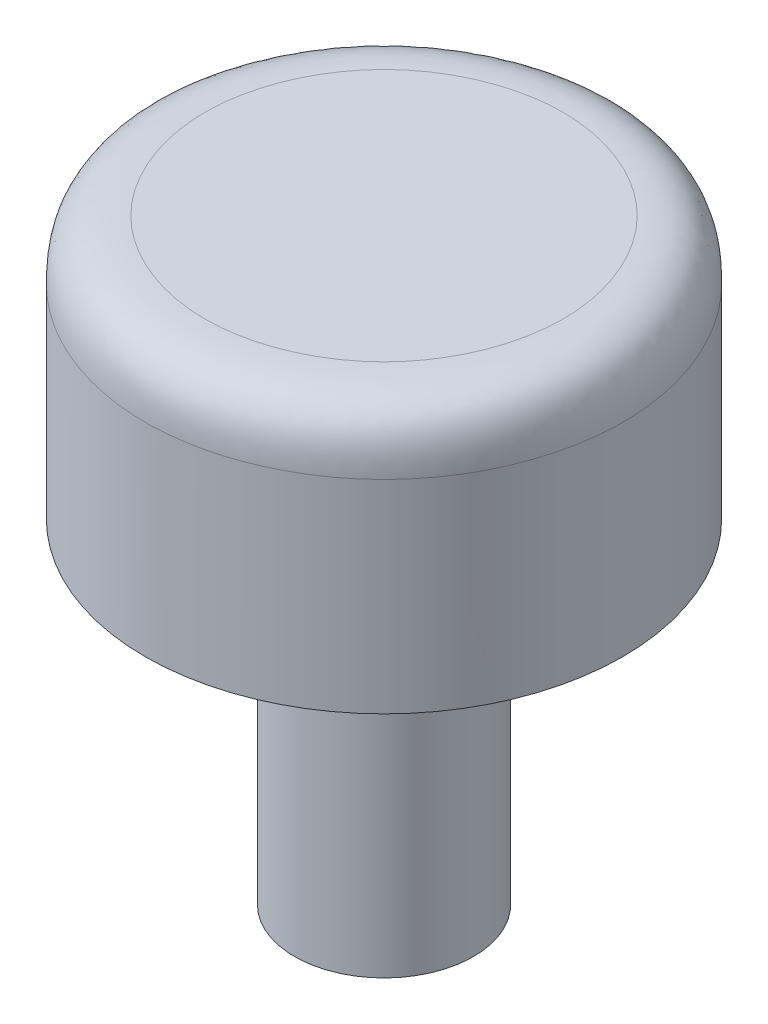
ISO-10303-21;
HEADER;
FILE_DESCRIPTION(('STEP AP214'),'2;1');
FILE_NAME('part.step','',(''),(''),'','','');
FILE_SCHEMA(('AUTOMOTIVE_DESIGN { 1 0 10303 214 1 1 1 1 }'));
ENDSEC;
DATA;
#1=APPLICATION_CONTEXT('core data for automotive mechanical design processes');
#2=APPLICATION_PROTOCOL_DEFINITION('international standard','automotive_design',2000,#1);
#3=PRODUCT_CONTEXT('',#1,'mechanical');
#4=PRODUCT('Part','Part','',(#3));
#5=PRODUCT_RELATED_PRODUCT_CATEGORY('part','',(#4));
#6=PRODUCT_DEFINITION_FORMATION('','',#4);
#7=PRODUCT_DEFINITION_CONTEXT('part definition',#1,'design');
#8=PRODUCT_DEFINITION('design','',#6,#7);
#9=PRODUCT_DEFINITION_SHAPE('','',#8);
#10=(LENGTH_UNIT() NAMED_UNIT(*) SI_UNIT(.MILLI.,.METRE.));
#11=(NAMED_UNIT(*) PLANE_ANGLE_UNIT() SI_UNIT($,.RADIAN.));
#12=(NAMED_UNIT(*) SI_UNIT($,.STERADIAN.) SOLID_ANGLE_UNIT());
#13=UNCERTAINTY_MEASURE_WITH_UNIT(LENGTH_MEASURE(1.E-05),#10,'distance_accuracy_value','');
#14=(GEOMETRIC_REPRESENTATION_CONTEXT(3) GLOBAL_UNCERTAINTY_ASSIGNED_CONTEXT((#13)) GLOBAL_UNIT_ASSIGNED_CONTEXT((#10,
#11,#12)) REPRESENTATION_CONTEXT('',''));
#15=CARTESIAN_POINT('',(0.,0.,0.));
#16=DIRECTION('',(0.,0.,1.));
#17=DIRECTION('',(1.,0.,0.));
#18=AXIS2_PLACEMENT_3D('',#15,#16,#17);
#19=CARTESIAN_POINT('',(0.,5.,0.));
#20=DIRECTION('',(0.,1.,0.));
#21=DIRECTION('',(0.,0.,1.));
#22=AXIS2_PLACEMENT_3D('',#19,#20,#21);
#23=PLANE('',#22);
#24=CARTESIAN_POINT('',(0.,5.,-1.5));
#25=CARTESIAN_POINT('',(0.391805812445612,5.,-1.5));
#26=CARTESIAN_POINT('',(1.17541743733684,5.,-1.17541743733684));
#27=CARTESIAN_POINT('',(1.66229128133158,5.,0.));
#28=CARTESIAN_POINT('',(1.17541743733684,5.,1.17541743733684));
#29=CARTESIAN_POINT('',(0.,5.,1.66229128133158));
#30=CARTESIAN_POINT('',(-1.17541743733684,5.,1.17541743733684));
#31=CARTESIAN_POINT('',(-1.66229128133158,5.,0.));
#32=CARTESIAN_POINT('',(-1.17541743733684,5.,-1.17541743733684));
#33=CARTESIAN_POINT('',(-0.391805812445612,5.,-1.5));
#34=CARTESIAN_POINT('',(0.,5.,-1.5));
#35=B_SPLINE_CURVE_WITH_KNOTS('',3,(#24,#25,#26,#27,#28,#29,#30,#31,#32,#33,#34),.UNSPECIFIED.,
.T.,.F.,(4,1,1,1,1,1,1,1,4),(-3.14159265358979,-2.35619449019234,-1.5707963267949,
-0.785398163397448,0.,0.785398163397448,1.5707963267949,2.35619449019234,3.14159265358979),.UNSPECIFIED.);
#36=CARTESIAN_POINT('',(0.,5.,-1.5));
#37=VERTEX_POINT('',#36);
#38=EDGE_CURVE('E10',#37,#37,#35,.F.);
#39=ORIENTED_EDGE('',*,*,#38,.T.);
#40=EDGE_LOOP('',(#39));
#41=FACE_BOUND('',#40,.T.);
#42=ADVANCED_FACE('F39',(#41),#23,.T.);
#43=CARTESIAN_POINT('',(0.,0.,0.));
#44=DIRECTION('',(0.,-1.,0.));
#45=DIRECTION('',(0.,0.,-1.));
#46=AXIS2_PLACEMENT_3D('',#43,#44,#45);
#47=CYLINDRICAL_SURFACE('',#46,2.);
#48=CARTESIAN_POINT('',(0.,4.5,-2.));
#49=CARTESIAN_POINT('',(-0.522407749927483,4.5,-2.));
#50=CARTESIAN_POINT('',(-1.56722324978245,4.5,-1.56722324978245));
#51=CARTESIAN_POINT('',(-2.21638837510878,4.5,0.));
#52=CARTESIAN_POINT('',(-1.56722324978245,4.5,1.56722324978245));
#53=CARTESIAN_POINT('',(0.,4.5,2.21638837510878));
#54=CARTESIAN_POINT('',(1.56722324978245,4.5,1.56722324978245));
#55=CARTESIAN_POINT('',(2.21638837510878,4.5,0.));
#56=CARTESIAN_POINT('',(1.56722324978245,4.5,-1.56722324978245));
#57=CARTESIAN_POINT('',(0.522407749927483,4.5,-2.));
#58=CARTESIAN_POINT('',(0.,4.5,-2.));
#59=B_SPLINE_CURVE_WITH_KNOTS('',3,(#48,#49,#50,#51,#52,#53,#54,#55,#56,#57,#58),.UNSPECIFIED.,
.T.,.F.,(4,1,1,1,1,1,1,1,4),(-3.14159265358979,-2.35619449019234,-1.5707963267949,
-0.785398163397448,0.,0.785398163397448,1.5707963267949,2.35619449019234,3.14159265358979),.UNSPECIFIED.);
#60=CARTESIAN_POINT('',(0.,4.5,-2.));
#61=VERTEX_POINT('',#60);
#62=EDGE_CURVE('E55',#61,#61,#59,.F.);
#63=ORIENTED_EDGE('',*,*,#62,.T.);
#64=EDGE_LOOP('',(#63));
#65=FACE_BOUND('',#64,.T.);
#66=CARTESIAN_POINT('',(0.,2.8,0.));
#67=DIRECTION('',(0.,-1.,0.));
#68=DIRECTION('',(0.,0.,-1.));
#69=AXIS2_PLACEMENT_3D('',#66,#67,#68);
#70=CIRCLE('',#69,2.);
#71=CARTESIAN_POINT('',(0.,2.8,-2.));
#72=VERTEX_POINT('',#71);
#73=EDGE_CURVE('E60',#72,#72,#70,.T.);
#74=ORIENTED_EDGE('',*,*,#73,.F.);
#75=EDGE_LOOP('',(#74));
#76=FACE_BOUND('',#75,.T.);
#77=ADVANCED_FACE('F73',(#65,#76),#47,.T.);
#78=CARTESIAN_POINT('',(1.5,2.8,0.));
#79=DIRECTION('',(0.,-1.,0.));
#80=DIRECTION('',(0.,0.,-1.));
#81=AXIS2_PLACEMENT_3D('',#78,#79,#80);
#82=PLANE('',#81);
#83=ORIENTED_EDGE('',*,*,#73,.T.);
#84=EDGE_LOOP('',(#83));
#85=FACE_BOUND('',#84,.T.);
#86=CARTESIAN_POINT('',(0.,2.8,0.));
#87=DIRECTION('',(0.,-1.,0.));
#88=DIRECTION('',(0.,0.,-1.));
#89=AXIS2_PLACEMENT_3D('',#86,#87,#88);
#90=CIRCLE('',#89,1.5);
#91=CARTESIAN_POINT('',(0.,2.8,-1.5));
#92=VERTEX_POINT('',#91);
#93=EDGE_CURVE('E62',#92,#92,#90,.T.);
#94=ORIENTED_EDGE('',*,*,#93,.F.);
#95=EDGE_LOOP('',(#94));
#96=FACE_BOUND('',#95,.T.);
#97=ADVANCED_FACE('F81',(#85,#96),#82,.T.);
#98=CARTESIAN_POINT('',(0.,0.,0.));
#99=DIRECTION('',(0.,-1.,0.));
#100=DIRECTION('',(0.,0.,-1.));
#101=AXIS2_PLACEMENT_3D('',#98,#99,#100);
#102=CYLINDRICAL_SURFACE('',#101,1.5);
#103=ORIENTED_EDGE('',*,*,#93,.T.);
#104=EDGE_LOOP('',(#103));
#105=FACE_BOUND('',#104,.T.);
#106=CARTESIAN_POINT('',(0.,4.5,0.));
#107=DIRECTION('',(0.,-1.,0.));
#108=DIRECTION('',(0.,0.,-1.));
#109=AXIS2_PLACEMENT_3D('',#106,#107,#108);
#110=CIRCLE('',#109,1.5);
#111=CARTESIAN_POINT('',(0.,4.5,-1.5));
#112=VERTEX_POINT('',#111);
#113=EDGE_CURVE('E70',#112,#112,#110,.T.);
#114=ORIENTED_EDGE('',*,*,#113,.F.);
#115=EDGE_LOOP('',(#114));
#116=FACE_BOUND('',#115,.T.);
#117=ADVANCED_FACE('F124',(#105,#116),#102,.F.);
#118=CARTESIAN_POINT('',(0.749999999999999,4.5,0.));
#119=DIRECTION('',(0.,-1.,0.));
#120=DIRECTION('',(0.,0.,-1.));
#121=AXIS2_PLACEMENT_3D('',#118,#119,#120);
#122=PLANE('',#121);
#123=ORIENTED_EDGE('',*,*,#113,.T.);
#124=EDGE_LOOP('',(#123));
#125=FACE_BOUND('',#124,.T.);
#126=CARTESIAN_POINT('',(0.,4.5,0.));
#127=DIRECTION('',(0.,-1.,0.));
#128=DIRECTION('',(0.,0.,-1.));
#129=AXIS2_PLACEMENT_3D('',#126,#127,#128);
#130=CIRCLE('',#129,0.749999999999999);
#131=CARTESIAN_POINT('',(0.,4.5,-0.749999999999999));
#132=VERTEX_POINT('',#131);
#133=EDGE_CURVE('E133',#132,#132,#130,.T.);
#134=ORIENTED_EDGE('',*,*,#133,.F.);
#135=EDGE_LOOP('',(#134));
#136=FACE_BOUND('',#135,.T.);
#137=ADVANCED_FACE('F117',(#125,#136),#122,.T.);
#138=CARTESIAN_POINT('',(0.,0.,0.));
#139=DIRECTION('',(0.,-1.,0.));
#140=DIRECTION('',(0.,0.,-1.));
#141=AXIS2_PLACEMENT_3D('',#138,#139,#140);
#142=CYLINDRICAL_SURFACE('',#141,0.75);
#143=ORIENTED_EDGE('',*,*,#133,.T.);
#144=EDGE_LOOP('',(#143));
#145=FACE_BOUND('',#144,.T.);
#146=CARTESIAN_POINT('',(0.,0.,0.));
#147=DIRECTION('',(0.,-1.,0.));
#148=DIRECTION('',(0.,0.,-1.));
#149=AXIS2_PLACEMENT_3D('',#146,#147,#148);
#150=CIRCLE('',#149,0.75);
#151=CARTESIAN_POINT('',(0.,0.,-0.75));
#152=VERTEX_POINT('',#151);
#153=EDGE_CURVE('E137',#152,#152,#150,.T.);
#154=ORIENTED_EDGE('',*,*,#153,.F.);
#155=EDGE_LOOP('',(#154));
#156=FACE_BOUND('',#155,.T.);
#157=ADVANCED_FACE('F112',(#145,#156),#142,.T.);
#158=CARTESIAN_POINT('',(0.75,0.,0.));
#159=DIRECTION('',(0.,-1.,0.));
#160=DIRECTION('',(0.,0.,-1.));
#161=AXIS2_PLACEMENT_3D('',#158,#159,#160);
#162=PLANE('',#161);
#163=ORIENTED_EDGE('',*,*,#153,.T.);
#164=EDGE_LOOP('',(#163));
#165=FACE_BOUND('',#164,.T.);
#166=ADVANCED_FACE('F110',(#165),#162,.T.);
#167=CARTESIAN_POINT('',(0.,5.,-1.5));
#168=CARTESIAN_POINT('',(-0.391805812445612,5.,-1.5));
#169=CARTESIAN_POINT('',(-1.17541743733684,5.,-1.17541743733684));
#170=CARTESIAN_POINT('',(-1.66229128133158,5.,0.));
#171=CARTESIAN_POINT('',(-1.17541743733684,5.,1.17541743733684));
#172=CARTESIAN_POINT('',(0.,5.,1.66229128133158));
#173=CARTESIAN_POINT('',(1.17541743733684,5.,1.17541743733684));
#174=CARTESIAN_POINT('',(1.66229128133158,5.,0.));
#175=CARTESIAN_POINT('',(1.17541743733684,5.,-1.17541743733684));
#176=CARTESIAN_POINT('',(0.391805812445612,5.,-1.5));
#177=CARTESIAN_POINT('',(0.,5.,-1.5));
#178=CARTESIAN_POINT('',(0.,5.,-1.58409902576697));
#179=CARTESIAN_POINT('',(-0.413772803856621,5.,-1.58409902576697));
#180=CARTESIAN_POINT('',(-1.24131841156986,5.,-1.24131841156986));
#181=CARTESIAN_POINT('',(-1.75548933286553,5.,0.));
#182=CARTESIAN_POINT('',(-1.24131841156986,5.,1.24131841156986));
#183=CARTESIAN_POINT('',(0.,5.,1.75548933286553));
#184=CARTESIAN_POINT('',(1.24131841156986,5.,1.24131841156986));
#185=CARTESIAN_POINT('',(1.75548933286553,5.,0.));
#186=CARTESIAN_POINT('',(1.24131841156986,5.,-1.24131841156987));
#187=CARTESIAN_POINT('',(0.413772803856621,5.,-1.58409902576697));
#188=CARTESIAN_POINT('',(0.,5.,-1.58409902576697));
#189=CARTESIAN_POINT('',(0.,5.,-1.66819805153395));
#190=CARTESIAN_POINT('',(-0.43573979526763,5.,-1.66819805153395));
#191=CARTESIAN_POINT('',(-1.30721938580289,5.,-1.30721938580289));
#192=CARTESIAN_POINT('',(-1.84868738439948,5.,0.));
#193=CARTESIAN_POINT('',(-1.30721938580289,5.,1.30721938580289));
#194=CARTESIAN_POINT('',(0.,5.,1.84868738439948));
#195=CARTESIAN_POINT('',(1.30721938580289,5.,1.30721938580289));
#196=CARTESIAN_POINT('',(1.84868738439948,5.,0.));
#197=CARTESIAN_POINT('',(1.30721938580289,5.,-1.30721938580289));
#198=CARTESIAN_POINT('',(0.435739795267631,5.,-1.66819805153395));
#199=CARTESIAN_POINT('',(0.,5.,-1.66819805153395));
#200=CARTESIAN_POINT('',(0.,4.96415404008196,-1.85355339059327));
#201=CARTESIAN_POINT('',(-0.484155328075144,4.96415404008196,-1.85355339059327));
#202=CARTESIAN_POINT('',(-1.45246598422544,4.96415404008196,-1.45246598422543));
#203=CARTESIAN_POINT('',(-2.05409709377719,4.96415404008196,0.));
#204=CARTESIAN_POINT('',(-1.45246598422543,4.96415404008196,1.45246598422543));
#205=CARTESIAN_POINT('',(0.,4.96415404008196,2.05409709377719));
#206=CARTESIAN_POINT('',(1.45246598422543,4.96415404008196,1.45246598422543));
#207=CARTESIAN_POINT('',(2.05409709377719,4.96415404008196,0.));
#208=CARTESIAN_POINT('',(1.45246598422543,4.96415404008196,-1.45246598422544));
#209=CARTESIAN_POINT('',(0.484155328075145,4.96415404008196,-1.85355339059327));
#210=CARTESIAN_POINT('',(0.,4.96415404008196,-1.85355339059327));
#211=CARTESIAN_POINT('',(0.,4.85355339059328,-1.96415404008196));
#212=CARTESIAN_POINT('',(-0.513044646295095,4.85355339059328,-1.96415404008196));
#213=CARTESIAN_POINT('',(-1.53913393888529,4.85355339059327,-1.53913393888529));
#214=CARTESIAN_POINT('',(-2.17666409068029,4.85355339059328,0.));
#215=CARTESIAN_POINT('',(-1.53913393888528,4.85355339059328,1.53913393888529));
#216=CARTESIAN_POINT('',(0.,4.85355339059328,2.17666409068029));
#217=CARTESIAN_POINT('',(1.53913393888529,4.85355339059327,1.53913393888529));
#218=CARTESIAN_POINT('',(2.1766640906803,4.85355339059328,0.));
#219=CARTESIAN_POINT('',(1.53913393888528,4.85355339059327,-1.53913393888529));
#220=CARTESIAN_POINT('',(0.513044646295096,4.85355339059328,-1.96415404008196));
#221=CARTESIAN_POINT('',(0.,4.85355339059328,-1.96415404008196));
#222=CARTESIAN_POINT('',(0.,4.66819805153395,-2.));
#223=CARTESIAN_POINT('',(-0.522407749927483,4.66819805153395,-2.));
#224=CARTESIAN_POINT('',(-1.56722324978245,4.66819805153395,-1.56722324978245));
#225=CARTESIAN_POINT('',(-2.21638837510878,4.66819805153395,0.));
#226=CARTESIAN_POINT('',(-1.56722324978245,4.66819805153395,1.56722324978245));
#227=CARTESIAN_POINT('',(0.,4.66819805153395,2.21638837510878));
#228=CARTESIAN_POINT('',(1.56722324978245,4.66819805153395,1.56722324978245));
#229=CARTESIAN_POINT('',(2.21638837510878,4.66819805153395,0.));
#230=CARTESIAN_POINT('',(1.56722324978245,4.66819805153395,-1.56722324978245));
#231=CARTESIAN_POINT('',(0.522407749927483,4.66819805153395,-2.));
#232=CARTESIAN_POINT('',(0.,4.66819805153395,-2.));
#233=CARTESIAN_POINT('',(0.,4.58409902576697,-2.));
#234=CARTESIAN_POINT('',(-0.522407749927483,4.58409902576697,-2.));
#235=CARTESIAN_POINT('',(-1.56722324978245,4.58409902576697,-1.56722324978245));
#236=CARTESIAN_POINT('',(-2.21638837510878,4.58409902576697,0.));
#237=CARTESIAN_POINT('',(-1.56722324978245,4.58409902576697,1.56722324978245));
#238=CARTESIAN_POINT('',(0.,4.58409902576697,2.21638837510878));
#239=CARTESIAN_POINT('',(1.56722324978245,4.58409902576697,1.56722324978245));
#240=CARTESIAN_POINT('',(2.21638837510878,4.58409902576697,0.));
#241=CARTESIAN_POINT('',(1.56722324978245,4.58409902576697,-1.56722324978245));
#242=CARTESIAN_POINT('',(0.522407749927483,4.58409902576697,-2.));
#243=CARTESIAN_POINT('',(0.,4.58409902576697,-2.));
#244=CARTESIAN_POINT('',(0.,4.5,-2.));
#245=CARTESIAN_POINT('',(-0.522407749927483,4.5,-2.));
#246=CARTESIAN_POINT('',(-1.56722324978245,4.5,-1.56722324978245));
#247=CARTESIAN_POINT('',(-2.21638837510878,4.5,0.));
#248=CARTESIAN_POINT('',(-1.56722324978245,4.5,1.56722324978245));
#249=CARTESIAN_POINT('',(0.,4.5,2.21638837510878));
#250=CARTESIAN_POINT('',(1.56722324978245,4.5,1.56722324978245));
#251=CARTESIAN_POINT('',(2.21638837510878,4.5,0.));
#252=CARTESIAN_POINT('',(1.56722324978245,4.5,-1.56722324978245));
#253=CARTESIAN_POINT('',(0.522407749927483,4.5,-2.));
#254=CARTESIAN_POINT('',(0.,4.5,-2.));
#255=B_SPLINE_SURFACE_WITH_KNOTS('',5,3,((#167,#168,#169,#170,#171,#172,#173,#174,#175,#176,
#177),(#178,#179,#180,#181,#182,#183,#184,#185,#186,#187,#188),(#189,#190,#191,#192,#193,#194,
#195,#196,#197,#198,#199),(#200,#201,#202,#203,#204,#205,#206,#207,#208,#209,#210),(#211,#212,
#213,#214,#215,#216,#217,#218,#219,#220,#221),(#222,#223,#224,#225,#226,#227,#228,#229,#230,
#231,#232),(#233,#234,#235,#236,#237,#238,#239,#240,#241,#242,#243),(#244,#245,#246,#247,#248,
#249,#250,#251,#252,#253,#254)),.UNSPECIFIED.,.F.,.T.,.F.,(6,2,6),(4,1,1,1,1,1,1,1,4),(0.,0.5,
1.),(-3.14159265358979,-2.35619449019234,-1.5707963267949,-0.785398163397448,0.,
0.785398163397448,1.5707963267949,2.35619449019234,3.14159265358979),.UNSPECIFIED.);
#256=ORIENTED_EDGE('',*,*,#38,.F.);
#257=EDGE_LOOP('',(#256));
#258=FACE_BOUND('',#257,.T.);
#259=ORIENTED_EDGE('',*,*,#62,.F.);
#260=EDGE_LOOP('',(#259));
#261=FACE_BOUND('',#260,.T.);
#262=ADVANCED_FACE('F45',(#258,#261),#255,.T.);
#263=CLOSED_SHELL('',(#42,#77,#97,#117,#137,#157,#166,#262));
#264=MANIFOLD_SOLID_BREP('B2',#263);
#265=ADVANCED_BREP_SHAPE_REPRESENTATION('',(#18,#264),#14);
#266=SHAPE_DEFINITION_REPRESENTATION(#9,#265);
ENDSEC;
END-ISO-10303-21;
